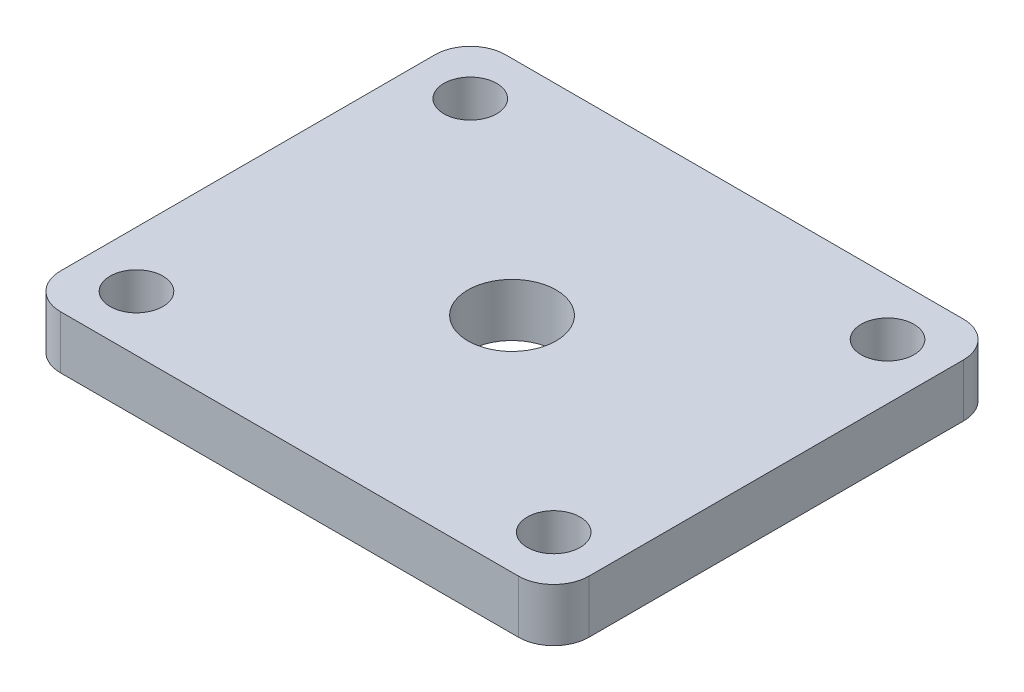
ISO-10303-21;
HEADER;
FILE_DESCRIPTION(('STEP AP214'),'2;1');
FILE_NAME('part.step','',(''),(''),'','','');
FILE_SCHEMA(('AUTOMOTIVE_DESIGN { 1 0 10303 214 1 1 1 1 }'));
ENDSEC;
DATA;
#1=APPLICATION_CONTEXT('core data for automotive mechanical design processes');
#2=APPLICATION_PROTOCOL_DEFINITION('international standard','automotive_design',2000,#1);
#3=PRODUCT_CONTEXT('',#1,'mechanical');
#4=PRODUCT('Part','Part','',(#3));
#5=PRODUCT_RELATED_PRODUCT_CATEGORY('part','',(#4));
#6=PRODUCT_DEFINITION_FORMATION('','',#4);
#7=PRODUCT_DEFINITION_CONTEXT('part definition',#1,'design');
#8=PRODUCT_DEFINITION('design','',#6,#7);
#9=PRODUCT_DEFINITION_SHAPE('','',#8);
#10=(LENGTH_UNIT() NAMED_UNIT(*) SI_UNIT(.MILLI.,.METRE.));
#11=(NAMED_UNIT(*) PLANE_ANGLE_UNIT() SI_UNIT($,.RADIAN.));
#12=(NAMED_UNIT(*) SI_UNIT($,.STERADIAN.) SOLID_ANGLE_UNIT());
#13=UNCERTAINTY_MEASURE_WITH_UNIT(LENGTH_MEASURE(1.E-05),#10,'distance_accuracy_value','');
#14=(GEOMETRIC_REPRESENTATION_CONTEXT(3) GLOBAL_UNCERTAINTY_ASSIGNED_CONTEXT((#13)) GLOBAL_UNIT_ASSIGNED_CONTEXT((#10,
#11,#12)) REPRESENTATION_CONTEXT('',''));
#15=CARTESIAN_POINT('',(0.,0.,0.));
#16=DIRECTION('',(0.,0.,1.));
#17=DIRECTION('',(1.,0.,0.));
#18=AXIS2_PLACEMENT_3D('',#15,#16,#17);
#19=CARTESIAN_POINT('',(0.,3.81,0.));
#20=DIRECTION('',(0.,-1.,0.));
#21=DIRECTION('',(0.,0.,-1.));
#22=AXIS2_PLACEMENT_3D('',#19,#20,#21);
#23=PLANE('',#22);
#24=DIRECTION('',(-1.,0.,0.));
#25=VECTOR('',#24,1.);
#26=CARTESIAN_POINT('',(0.,3.81,-32.));
#27=LINE('',#26,#25);
#28=CARTESIAN_POINT('',(35.46,3.81,-32.));
#29=VERTEX_POINT('',#28);
#30=CARTESIAN_POINT('',(2.54,3.81,-32.));
#31=VERTEX_POINT('',#30);
#32=EDGE_CURVE('E148',#29,#31,#27,.T.);
#33=ORIENTED_EDGE('',*,*,#32,.T.);
#34=CARTESIAN_POINT('',(2.54,3.81,-29.46));
#35=DIRECTION('',(0.,-1.,0.));
#36=DIRECTION('',(0.,0.,-1.));
#37=AXIS2_PLACEMENT_3D('',#34,#35,#36);
#38=CIRCLE('',#37,2.54);
#39=CARTESIAN_POINT('',(0.,3.81,-29.46));
#40=VERTEX_POINT('',#39);
#41=EDGE_CURVE('E178',#31,#40,#38,.F.);
#42=ORIENTED_EDGE('',*,*,#41,.T.);
#43=DIRECTION('',(0.,0.,1.));
#44=VECTOR('',#43,1.);
#45=CARTESIAN_POINT('',(0.,3.81,0.));
#46=LINE('',#45,#44);
#47=CARTESIAN_POINT('',(0.,3.81,-2.54));
#48=VERTEX_POINT('',#47);
#49=EDGE_CURVE('E127',#40,#48,#46,.T.);
#50=ORIENTED_EDGE('',*,*,#49,.T.);
#51=CARTESIAN_POINT('',(2.54,3.81,-2.54));
#52=DIRECTION('',(0.,-1.,0.));
#53=DIRECTION('',(0.,0.,-1.));
#54=AXIS2_PLACEMENT_3D('',#51,#52,#53);
#55=CIRCLE('',#54,2.54);
#56=CARTESIAN_POINT('',(2.54,3.81,0.));
#57=VERTEX_POINT('',#56);
#58=EDGE_CURVE('E170',#48,#57,#55,.F.);
#59=ORIENTED_EDGE('',*,*,#58,.T.);
#60=DIRECTION('',(1.,0.,0.));
#61=VECTOR('',#60,1.);
#62=CARTESIAN_POINT('',(0.,3.81,0.));
#63=LINE('',#62,#61);
#64=CARTESIAN_POINT('',(35.46,3.81,0.));
#65=VERTEX_POINT('',#64);
#66=EDGE_CURVE('E193',#57,#65,#63,.T.);
#67=ORIENTED_EDGE('',*,*,#66,.T.);
#68=CARTESIAN_POINT('',(35.46,3.81,-2.54));
#69=DIRECTION('',(0.,-1.,0.));
#70=DIRECTION('',(0.,0.,-1.));
#71=AXIS2_PLACEMENT_3D('',#68,#69,#70);
#72=CIRCLE('',#71,2.54);
#73=CARTESIAN_POINT('',(38.,3.81,-2.54));
#74=VERTEX_POINT('',#73);
#75=EDGE_CURVE('E62',#65,#74,#72,.F.);
#76=ORIENTED_EDGE('',*,*,#75,.T.);
#77=DIRECTION('',(0.,0.,-1.));
#78=VECTOR('',#77,1.);
#79=CARTESIAN_POINT('',(38.,3.81,0.));
#80=LINE('',#79,#78);
#81=CARTESIAN_POINT('',(38.,3.81,-29.46));
#82=VERTEX_POINT('',#81);
#83=EDGE_CURVE('E201',#74,#82,#80,.T.);
#84=ORIENTED_EDGE('',*,*,#83,.T.);
#85=CARTESIAN_POINT('',(35.46,3.81,-29.46));
#86=DIRECTION('',(0.,-1.,0.));
#87=DIRECTION('',(0.,0.,-1.));
#88=AXIS2_PLACEMENT_3D('',#85,#86,#87);
#89=CIRCLE('',#88,2.54);
#90=EDGE_CURVE('E175',#82,#29,#89,.F.);
#91=ORIENTED_EDGE('',*,*,#90,.T.);
#92=EDGE_LOOP('',(#33,#42,#50,#59,#67,#76,#84,#91));
#93=FACE_BOUND('',#92,.T.);
#94=CARTESIAN_POINT('',(19.,3.81,-16.));
#95=DIRECTION('',(0.,1.,0.));
#96=DIRECTION('',(0.,0.,1.));
#97=AXIS2_PLACEMENT_3D('',#94,#95,#96);
#98=CIRCLE('',#97,3.175);
#99=CARTESIAN_POINT('',(19.,3.81,-19.175));
#100=VERTEX_POINT('',#99);
#101=EDGE_CURVE('E137',#100,#100,#98,.T.);
#102=ORIENTED_EDGE('',*,*,#101,.F.);
#103=EDGE_LOOP('',(#102));
#104=FACE_BOUND('',#103,.T.);
#105=CARTESIAN_POINT('',(4.,3.81,-4.00000000000001));
#106=DIRECTION('',(0.,1.,0.));
#107=DIRECTION('',(0.,0.,1.));
#108=AXIS2_PLACEMENT_3D('',#105,#106,#107);
#109=CIRCLE('',#108,1.89865);
#110=CARTESIAN_POINT('',(4.,3.81,-5.89865000000001));
#111=VERTEX_POINT('',#110);
#112=EDGE_CURVE('E213',#111,#111,#109,.T.);
#113=ORIENTED_EDGE('',*,*,#112,.F.);
#114=EDGE_LOOP('',(#113));
#115=FACE_BOUND('',#114,.T.);
#116=CARTESIAN_POINT('',(4.,3.81,-28.));
#117=DIRECTION('',(0.,1.,0.));
#118=DIRECTION('',(0.,0.,1.));
#119=AXIS2_PLACEMENT_3D('',#116,#117,#118);
#120=CIRCLE('',#119,1.89865);
#121=CARTESIAN_POINT('',(4.,3.81,-29.89865));
#122=VERTEX_POINT('',#121);
#123=EDGE_CURVE('E219',#122,#122,#120,.T.);
#124=ORIENTED_EDGE('',*,*,#123,.F.);
#125=EDGE_LOOP('',(#124));
#126=FACE_BOUND('',#125,.T.);
#127=CARTESIAN_POINT('',(34.,3.81,-28.));
#128=DIRECTION('',(0.,1.,0.));
#129=DIRECTION('',(0.,0.,1.));
#130=AXIS2_PLACEMENT_3D('',#127,#128,#129);
#131=CIRCLE('',#130,1.89865);
#132=CARTESIAN_POINT('',(34.,3.81,-29.89865));
#133=VERTEX_POINT('',#132);
#134=EDGE_CURVE('E227',#133,#133,#131,.T.);
#135=ORIENTED_EDGE('',*,*,#134,.F.);
#136=EDGE_LOOP('',(#135));
#137=FACE_BOUND('',#136,.T.);
#138=CARTESIAN_POINT('',(34.,3.81,-4.));
#139=DIRECTION('',(0.,1.,0.));
#140=DIRECTION('',(0.,0.,1.));
#141=AXIS2_PLACEMENT_3D('',#138,#139,#140);
#142=CIRCLE('',#141,1.89865);
#143=CARTESIAN_POINT('',(34.,3.81,-5.89865));
#144=VERTEX_POINT('',#143);
#145=EDGE_CURVE('E235',#144,#144,#142,.T.);
#146=ORIENTED_EDGE('',*,*,#145,.F.);
#147=EDGE_LOOP('',(#146));
#148=FACE_BOUND('',#147,.T.);
#149=ADVANCED_FACE('F39',(#93,#104,#115,#126,#137,#148),#23,.F.);
#150=CARTESIAN_POINT('',(0.,0.,0.));
#151=DIRECTION('',(0.,-1.,0.));
#152=DIRECTION('',(0.,0.,-1.));
#153=AXIS2_PLACEMENT_3D('',#150,#151,#152);
#154=PLANE('',#153);
#155=CARTESIAN_POINT('',(34.,0.,-28.));
#156=DIRECTION('',(0.,1.,0.));
#157=DIRECTION('',(0.,0.,1.));
#158=AXIS2_PLACEMENT_3D('',#155,#156,#157);
#159=CIRCLE('',#158,1.89865);
#160=CARTESIAN_POINT('',(34.,0.,-29.89865));
#161=VERTEX_POINT('',#160);
#162=EDGE_CURVE('E231',#161,#161,#159,.T.);
#163=ORIENTED_EDGE('',*,*,#162,.T.);
#164=EDGE_LOOP('',(#163));
#165=FACE_BOUND('',#164,.T.);
#166=CARTESIAN_POINT('',(4.,0.,-4.00000000000001));
#167=DIRECTION('',(0.,1.,0.));
#168=DIRECTION('',(0.,0.,1.));
#169=AXIS2_PLACEMENT_3D('',#166,#167,#168);
#170=CIRCLE('',#169,1.89865);
#171=CARTESIAN_POINT('',(4.,0.,-5.89865000000001));
#172=VERTEX_POINT('',#171);
#173=EDGE_CURVE('E215',#172,#172,#170,.T.);
#174=ORIENTED_EDGE('',*,*,#173,.T.);
#175=EDGE_LOOP('',(#174));
#176=FACE_BOUND('',#175,.T.);
#177=DIRECTION('',(0.,0.,1.));
#178=VECTOR('',#177,1.);
#179=CARTESIAN_POINT('',(0.,0.,0.));
#180=LINE('',#179,#178);
#181=CARTESIAN_POINT('',(0.,0.,-29.46));
#182=VERTEX_POINT('',#181);
#183=CARTESIAN_POINT('',(0.,0.,-2.54));
#184=VERTEX_POINT('',#183);
#185=EDGE_CURVE('E124',#182,#184,#180,.T.);
#186=ORIENTED_EDGE('',*,*,#185,.F.);
#187=CARTESIAN_POINT('',(2.54,0.,-29.46));
#188=DIRECTION('',(0.,-1.,0.));
#189=DIRECTION('',(0.,0.,-1.));
#190=AXIS2_PLACEMENT_3D('',#187,#188,#189);
#191=CIRCLE('',#190,2.54);
#192=CARTESIAN_POINT('',(2.54,0.,-32.));
#193=VERTEX_POINT('',#192);
#194=EDGE_CURVE('E106',#182,#193,#191,.T.);
#195=ORIENTED_EDGE('',*,*,#194,.T.);
#196=DIRECTION('',(-1.,0.,0.));
#197=VECTOR('',#196,1.);
#198=CARTESIAN_POINT('',(0.,0.,-32.));
#199=LINE('',#198,#197);
#200=CARTESIAN_POINT('',(35.46,0.,-32.));
#201=VERTEX_POINT('',#200);
#202=EDGE_CURVE('E153',#201,#193,#199,.T.);
#203=ORIENTED_EDGE('',*,*,#202,.F.);
#204=CARTESIAN_POINT('',(35.46,0.,-29.46));
#205=DIRECTION('',(0.,-1.,0.));
#206=DIRECTION('',(0.,0.,-1.));
#207=AXIS2_PLACEMENT_3D('',#204,#205,#206);
#208=CIRCLE('',#207,2.54);
#209=CARTESIAN_POINT('',(38.,0.,-29.46));
#210=VERTEX_POINT('',#209);
#211=EDGE_CURVE('E118',#201,#210,#208,.T.);
#212=ORIENTED_EDGE('',*,*,#211,.T.);
#213=DIRECTION('',(0.,0.,-1.));
#214=VECTOR('',#213,1.);
#215=CARTESIAN_POINT('',(38.,0.,0.));
#216=LINE('',#215,#214);
#217=CARTESIAN_POINT('',(38.,0.,-2.54));
#218=VERTEX_POINT('',#217);
#219=EDGE_CURVE('E142',#218,#210,#216,.T.);
#220=ORIENTED_EDGE('',*,*,#219,.F.);
#221=CARTESIAN_POINT('',(35.46,0.,-2.54));
#222=DIRECTION('',(0.,-1.,0.));
#223=DIRECTION('',(0.,0.,-1.));
#224=AXIS2_PLACEMENT_3D('',#221,#222,#223);
#225=CIRCLE('',#224,2.54);
#226=CARTESIAN_POINT('',(35.46,0.,0.));
#227=VERTEX_POINT('',#226);
#228=EDGE_CURVE('E160',#218,#227,#225,.T.);
#229=ORIENTED_EDGE('',*,*,#228,.T.);
#230=DIRECTION('',(1.,0.,0.));
#231=VECTOR('',#230,1.);
#232=CARTESIAN_POINT('',(0.,0.,0.));
#233=LINE('',#232,#231);
#234=CARTESIAN_POINT('',(2.54,0.,0.));
#235=VERTEX_POINT('',#234);
#236=EDGE_CURVE('E136',#235,#227,#233,.T.);
#237=ORIENTED_EDGE('',*,*,#236,.F.);
#238=CARTESIAN_POINT('',(2.54,0.,-2.54));
#239=DIRECTION('',(0.,-1.,0.));
#240=DIRECTION('',(0.,0.,-1.));
#241=AXIS2_PLACEMENT_3D('',#238,#239,#240);
#242=CIRCLE('',#241,2.54);
#243=EDGE_CURVE('E129',#235,#184,#242,.T.);
#244=ORIENTED_EDGE('',*,*,#243,.T.);
#245=EDGE_LOOP('',(#186,#195,#203,#212,#220,#229,#237,#244));
#246=FACE_BOUND('',#245,.T.);
#247=CARTESIAN_POINT('',(19.,0.,-16.));
#248=DIRECTION('',(0.,1.,0.));
#249=DIRECTION('',(0.,0.,1.));
#250=AXIS2_PLACEMENT_3D('',#247,#248,#249);
#251=CIRCLE('',#250,3.175);
#252=CARTESIAN_POINT('',(19.,0.,-19.175));
#253=VERTEX_POINT('',#252);
#254=EDGE_CURVE('E145',#253,#253,#251,.T.);
#255=ORIENTED_EDGE('',*,*,#254,.T.);
#256=EDGE_LOOP('',(#255));
#257=FACE_BOUND('',#256,.T.);
#258=CARTESIAN_POINT('',(4.,0.,-28.));
#259=DIRECTION('',(0.,1.,0.));
#260=DIRECTION('',(0.,0.,1.));
#261=AXIS2_PLACEMENT_3D('',#258,#259,#260);
#262=CIRCLE('',#261,1.89865);
#263=CARTESIAN_POINT('',(4.,0.,-29.89865));
#264=VERTEX_POINT('',#263);
#265=EDGE_CURVE('E223',#264,#264,#262,.T.);
#266=ORIENTED_EDGE('',*,*,#265,.T.);
#267=EDGE_LOOP('',(#266));
#268=FACE_BOUND('',#267,.T.);
#269=CARTESIAN_POINT('',(34.,0.,-4.));
#270=DIRECTION('',(0.,1.,0.));
#271=DIRECTION('',(0.,0.,1.));
#272=AXIS2_PLACEMENT_3D('',#269,#270,#271);
#273=CIRCLE('',#272,1.89865);
#274=CARTESIAN_POINT('',(34.,0.,-5.89865));
#275=VERTEX_POINT('',#274);
#276=EDGE_CURVE('E239',#275,#275,#273,.T.);
#277=ORIENTED_EDGE('',*,*,#276,.T.);
#278=EDGE_LOOP('',(#277));
#279=FACE_BOUND('',#278,.T.);
#280=ADVANCED_FACE('F132',(#165,#176,#246,#257,#268,#279),#154,.T.);
#281=CARTESIAN_POINT('',(0.,3.81,0.));
#282=DIRECTION('',(1.,0.,0.));
#283=DIRECTION('',(0.,0.,-1.));
#284=AXIS2_PLACEMENT_3D('',#281,#282,#283);
#285=PLANE('',#284);
#286=ORIENTED_EDGE('',*,*,#49,.F.);
#287=DIRECTION('',(0.,-1.,0.));
#288=VECTOR('',#287,1.);
#289=CARTESIAN_POINT('',(0.,3.81,-29.46));
#290=LINE('',#289,#288);
#291=EDGE_CURVE('E110',#40,#182,#290,.T.);
#292=ORIENTED_EDGE('',*,*,#291,.T.);
#293=ORIENTED_EDGE('',*,*,#185,.T.);
#294=DIRECTION('',(0.,-1.,0.));
#295=VECTOR('',#294,1.);
#296=CARTESIAN_POINT('',(0.,3.81,-2.54));
#297=LINE('',#296,#295);
#298=EDGE_CURVE('E130',#184,#48,#297,.F.);
#299=ORIENTED_EDGE('',*,*,#298,.T.);
#300=EDGE_LOOP('',(#286,#292,#293,#299));
#301=FACE_BOUND('',#300,.T.);
#302=ADVANCED_FACE('F123',(#301),#285,.F.);
#303=CARTESIAN_POINT('',(0.,3.81,0.));
#304=DIRECTION('',(0.,0.,-1.));
#305=DIRECTION('',(-1.,0.,0.));
#306=AXIS2_PLACEMENT_3D('',#303,#304,#305);
#307=PLANE('',#306);
#308=ORIENTED_EDGE('',*,*,#236,.T.);
#309=DIRECTION('',(0.,-1.,0.));
#310=VECTOR('',#309,1.);
#311=CARTESIAN_POINT('',(35.46,3.81,0.));
#312=LINE('',#311,#310);
#313=EDGE_CURVE('E11',#227,#65,#312,.F.);
#314=ORIENTED_EDGE('',*,*,#313,.T.);
#315=ORIENTED_EDGE('',*,*,#66,.F.);
#316=DIRECTION('',(0.,-1.,0.));
#317=VECTOR('',#316,1.);
#318=CARTESIAN_POINT('',(2.54,3.81,0.));
#319=LINE('',#318,#317);
#320=EDGE_CURVE('E48',#57,#235,#319,.T.);
#321=ORIENTED_EDGE('',*,*,#320,.T.);
#322=EDGE_LOOP('',(#308,#314,#315,#321));
#323=FACE_BOUND('',#322,.T.);
#324=ADVANCED_FACE('F191',(#323),#307,.F.);
#325=CARTESIAN_POINT('',(38.,3.81,0.));
#326=DIRECTION('',(-1.,0.,0.));
#327=DIRECTION('',(0.,0.,1.));
#328=AXIS2_PLACEMENT_3D('',#325,#326,#327);
#329=PLANE('',#328);
#330=ORIENTED_EDGE('',*,*,#219,.T.);
#331=DIRECTION('',(0.,-1.,0.));
#332=VECTOR('',#331,1.);
#333=CARTESIAN_POINT('',(38.,3.81,-29.46));
#334=LINE('',#333,#332);
#335=EDGE_CURVE('E55',#210,#82,#334,.F.);
#336=ORIENTED_EDGE('',*,*,#335,.T.);
#337=ORIENTED_EDGE('',*,*,#83,.F.);
#338=DIRECTION('',(0.,-1.,0.));
#339=VECTOR('',#338,1.);
#340=CARTESIAN_POINT('',(38.,3.81,-2.54));
#341=LINE('',#340,#339);
#342=EDGE_CURVE('E181',#74,#218,#341,.T.);
#343=ORIENTED_EDGE('',*,*,#342,.T.);
#344=EDGE_LOOP('',(#330,#336,#337,#343));
#345=FACE_BOUND('',#344,.T.);
#346=ADVANCED_FACE('F200',(#345),#329,.F.);
#347=CARTESIAN_POINT('',(0.,3.81,-32.));
#348=DIRECTION('',(0.,0.,1.));
#349=DIRECTION('',(1.,0.,0.));
#350=AXIS2_PLACEMENT_3D('',#347,#348,#349);
#351=PLANE('',#350);
#352=ORIENTED_EDGE('',*,*,#202,.T.);
#353=DIRECTION('',(0.,-1.,0.));
#354=VECTOR('',#353,1.);
#355=CARTESIAN_POINT('',(2.54,3.81,-32.));
#356=LINE('',#355,#354);
#357=EDGE_CURVE('E111',#193,#31,#356,.F.);
#358=ORIENTED_EDGE('',*,*,#357,.T.);
#359=ORIENTED_EDGE('',*,*,#32,.F.);
#360=DIRECTION('',(0.,-1.,0.));
#361=VECTOR('',#360,1.);
#362=CARTESIAN_POINT('',(35.46,3.81,-32.));
#363=LINE('',#362,#361);
#364=EDGE_CURVE('E117',#29,#201,#363,.T.);
#365=ORIENTED_EDGE('',*,*,#364,.T.);
#366=EDGE_LOOP('',(#352,#358,#359,#365));
#367=FACE_BOUND('',#366,.T.);
#368=ADVANCED_FACE('F262',(#367),#351,.F.);
#369=CARTESIAN_POINT('',(19.,3.81,-16.));
#370=DIRECTION('',(0.,-1.,0.));
#371=DIRECTION('',(0.,0.,-1.));
#372=AXIS2_PLACEMENT_3D('',#369,#370,#371);
#373=CYLINDRICAL_SURFACE('',#372,3.175);
#374=CARTESIAN_POINT('',(19.,3.81,-19.175));
#375=CARTESIAN_POINT('',(19.,3.7703125,-19.175));
#376=CARTESIAN_POINT('',(19.,3.730625,-19.175));
#377=CARTESIAN_POINT('',(19.,3.65125,-19.175));
#378=CARTESIAN_POINT('',(19.,3.6115625,-19.175));
#379=CARTESIAN_POINT('',(19.,3.5321875,-19.175));
#380=CARTESIAN_POINT('',(19.,3.4925,-19.175));
#381=CARTESIAN_POINT('',(19.,3.413125,-19.175));
#382=CARTESIAN_POINT('',(19.,3.3734375,-19.175));
#383=CARTESIAN_POINT('',(19.,3.2940625,-19.175));
#384=CARTESIAN_POINT('',(19.,3.254375,-19.175));
#385=CARTESIAN_POINT('',(19.,3.175,-19.175));
#386=CARTESIAN_POINT('',(19.,3.1353125,-19.175));
#387=CARTESIAN_POINT('',(19.,3.0559375,-19.175));
#388=CARTESIAN_POINT('',(19.,3.01625,-19.175));
#389=CARTESIAN_POINT('',(19.,2.936875,-19.175));
#390=CARTESIAN_POINT('',(19.,2.8971875,-19.175));
#391=CARTESIAN_POINT('',(19.,2.8178125,-19.175));
#392=CARTESIAN_POINT('',(19.,2.778125,-19.175));
#393=CARTESIAN_POINT('',(19.,2.69875,-19.175));
#394=CARTESIAN_POINT('',(19.,2.6590625,-19.175));
#395=CARTESIAN_POINT('',(19.,2.5796875,-19.175));
#396=CARTESIAN_POINT('',(19.,2.54,-19.175));
#397=CARTESIAN_POINT('',(19.,2.460625,-19.175));
#398=CARTESIAN_POINT('',(19.,2.4209375,-19.175));
#399=CARTESIAN_POINT('',(19.,2.3415625,-19.175));
#400=CARTESIAN_POINT('',(19.,2.301875,-19.175));
#401=CARTESIAN_POINT('',(19.,2.2225,-19.175));
#402=CARTESIAN_POINT('',(19.,2.1828125,-19.175));
#403=CARTESIAN_POINT('',(19.,2.1034375,-19.175));
#404=CARTESIAN_POINT('',(19.,2.06375,-19.175));
#405=CARTESIAN_POINT('',(19.,1.984375,-19.175));
#406=CARTESIAN_POINT('',(19.,1.9446875,-19.175));
#407=CARTESIAN_POINT('',(19.,1.8653125,-19.175));
#408=CARTESIAN_POINT('',(19.,1.825625,-19.175));
#409=CARTESIAN_POINT('',(19.,1.74625,-19.175));
#410=CARTESIAN_POINT('',(19.,1.7065625,-19.175));
#411=CARTESIAN_POINT('',(19.,1.6271875,-19.175));
#412=CARTESIAN_POINT('',(19.,1.5875,-19.175));
#413=CARTESIAN_POINT('',(19.,1.508125,-19.175));
#414=CARTESIAN_POINT('',(19.,1.4684375,-19.175));
#415=CARTESIAN_POINT('',(19.,1.3890625,-19.175));
#416=CARTESIAN_POINT('',(19.,1.349375,-19.175));
#417=CARTESIAN_POINT('',(19.,1.27,-19.175));
#418=CARTESIAN_POINT('',(19.,1.2303125,-19.175));
#419=CARTESIAN_POINT('',(19.,1.1509375,-19.175));
#420=CARTESIAN_POINT('',(19.,1.11125,-19.175));
#421=CARTESIAN_POINT('',(19.,1.031875,-19.175));
#422=CARTESIAN_POINT('',(19.,0.9921875,-19.175));
#423=CARTESIAN_POINT('',(19.,0.9128125,-19.175));
#424=CARTESIAN_POINT('',(19.,0.873125,-19.175));
#425=CARTESIAN_POINT('',(19.,0.79375,-19.175));
#426=CARTESIAN_POINT('',(19.,0.7540625,-19.175));
#427=CARTESIAN_POINT('',(19.,0.6746875,-19.175));
#428=CARTESIAN_POINT('',(19.,0.635,-19.175));
#429=CARTESIAN_POINT('',(19.,0.555625,-19.175));
#430=CARTESIAN_POINT('',(19.,0.5159375,-19.175));
#431=CARTESIAN_POINT('',(19.,0.4365625,-19.175));
#432=CARTESIAN_POINT('',(19.,0.396875,-19.175));
#433=CARTESIAN_POINT('',(19.,0.3175,-19.175));
#434=CARTESIAN_POINT('',(19.,0.2778125,-19.175));
#435=CARTESIAN_POINT('',(19.,0.1984375,-19.175));
#436=CARTESIAN_POINT('',(19.,0.15875,-19.175));
#437=CARTESIAN_POINT('',(19.,0.0793749999999999,-19.175));
#438=CARTESIAN_POINT('',(19.,0.0396874999999999,-19.175));
#439=CARTESIAN_POINT('',(19.,0.,-19.175));
#440=B_SPLINE_CURVE_WITH_KNOTS('',3,(#374,#375,#376,#377,#378,#379,#380,#381,#382,#383,#384,
#385,#386,#387,#388,#389,#390,#391,#392,#393,#394,#395,#396,#397,#398,#399,#400,#401,#402,#403,
#404,#405,#406,#407,#408,#409,#410,#411,#412,#413,#414,#415,#416,#417,#418,#419,#420,#421,#422,
#423,#424,#425,#426,#427,#428,#429,#430,#431,#432,#433,#434,#435,#436,#437,#438,#439),
.UNSPECIFIED.,.F.,.F.,(4,2,2,2,2,2,2,2,2,2,2,2,2,2,2,2,2,2,2,2,2,2,2,2,2,2,2,2,2,2,2,2,4),(0.,
0.1190625,0.238125,0.3571875,0.47625,0.595312499999999,0.714375,0.833437499999999,
0.952499999999999,1.0715625,1.190625,1.3096875,1.42875,1.5478125,1.666875,1.7859375,1.905,
2.0240625,2.143125,2.2621875,2.38125,2.5003125,2.619375,2.7384375,2.8575,2.9765625,3.095625,
3.2146875,3.33375,3.4528125,3.571875,3.6909375,3.81),.UNSPECIFIED.);
#441=EDGE_CURVE('BSEAM259',#100,#253,#440,.T.);
#442=ORIENTED_EDGE('',*,*,#101,.T.);
#443=ORIENTED_EDGE('',*,*,#254,.F.);
#444=ORIENTED_EDGE('',*,*,#441,.T.);
#445=ORIENTED_EDGE('',*,*,#441,.F.);
#446=EDGE_LOOP('',(#442,#444,#443,#445));
#447=FACE_BOUND('',#446,.T.);
#448=ADVANCED_FACE('F259',(#447),#373,.F.);
#449=CARTESIAN_POINT('',(4.,3.81,-4.00000000000001));
#450=DIRECTION('',(0.,-1.,0.));
#451=DIRECTION('',(0.,0.,-1.));
#452=AXIS2_PLACEMENT_3D('',#449,#450,#451);
#453=CYLINDRICAL_SURFACE('',#452,1.89865);
#454=CARTESIAN_POINT('',(4.,3.81,-5.89865000000001));
#455=CARTESIAN_POINT('',(4.,3.7703125,-5.89865000000001));
#456=CARTESIAN_POINT('',(4.,3.730625,-5.89865000000001));
#457=CARTESIAN_POINT('',(4.,3.65125,-5.89865000000001));
#458=CARTESIAN_POINT('',(4.,3.6115625,-5.89865000000001));
#459=CARTESIAN_POINT('',(4.,3.5321875,-5.89865000000001));
#460=CARTESIAN_POINT('',(4.,3.4925,-5.89865000000001));
#461=CARTESIAN_POINT('',(4.,3.413125,-5.89865000000001));
#462=CARTESIAN_POINT('',(4.,3.3734375,-5.89865000000001));
#463=CARTESIAN_POINT('',(4.,3.2940625,-5.89865000000001));
#464=CARTESIAN_POINT('',(4.,3.254375,-5.89865000000001));
#465=CARTESIAN_POINT('',(4.,3.175,-5.89865000000001));
#466=CARTESIAN_POINT('',(4.,3.1353125,-5.89865000000001));
#467=CARTESIAN_POINT('',(4.,3.0559375,-5.89865000000001));
#468=CARTESIAN_POINT('',(4.,3.01625,-5.89865000000001));
#469=CARTESIAN_POINT('',(4.,2.936875,-5.89865000000001));
#470=CARTESIAN_POINT('',(4.,2.8971875,-5.89865000000001));
#471=CARTESIAN_POINT('',(4.,2.8178125,-5.89865000000001));
#472=CARTESIAN_POINT('',(4.,2.778125,-5.89865000000001));
#473=CARTESIAN_POINT('',(4.,2.69875,-5.89865000000001));
#474=CARTESIAN_POINT('',(4.,2.6590625,-5.89865000000001));
#475=CARTESIAN_POINT('',(4.,2.5796875,-5.89865000000001));
#476=CARTESIAN_POINT('',(4.,2.54,-5.89865000000001));
#477=CARTESIAN_POINT('',(4.,2.460625,-5.89865000000001));
#478=CARTESIAN_POINT('',(4.,2.4209375,-5.89865000000001));
#479=CARTESIAN_POINT('',(4.,2.3415625,-5.89865000000001));
#480=CARTESIAN_POINT('',(4.,2.301875,-5.89865000000001));
#481=CARTESIAN_POINT('',(4.,2.2225,-5.89865000000001));
#482=CARTESIAN_POINT('',(4.,2.1828125,-5.89865000000001));
#483=CARTESIAN_POINT('',(4.,2.1034375,-5.89865000000001));
#484=CARTESIAN_POINT('',(4.,2.06375,-5.89865000000001));
#485=CARTESIAN_POINT('',(4.,1.984375,-5.89865000000001));
#486=CARTESIAN_POINT('',(4.,1.9446875,-5.89865000000001));
#487=CARTESIAN_POINT('',(4.,1.8653125,-5.89865000000001));
#488=CARTESIAN_POINT('',(4.,1.825625,-5.89865000000001));
#489=CARTESIAN_POINT('',(4.,1.74625,-5.89865000000001));
#490=CARTESIAN_POINT('',(4.,1.7065625,-5.89865000000001));
#491=CARTESIAN_POINT('',(4.,1.6271875,-5.89865000000001));
#492=CARTESIAN_POINT('',(4.,1.5875,-5.89865000000001));
#493=CARTESIAN_POINT('',(4.,1.508125,-5.89865000000001));
#494=CARTESIAN_POINT('',(4.,1.4684375,-5.89865000000001));
#495=CARTESIAN_POINT('',(4.,1.3890625,-5.89865000000001));
#496=CARTESIAN_POINT('',(4.,1.349375,-5.89865000000001));
#497=CARTESIAN_POINT('',(4.,1.27,-5.89865000000001));
#498=CARTESIAN_POINT('',(4.,1.2303125,-5.89865000000001));
#499=CARTESIAN_POINT('',(4.,1.1509375,-5.89865000000001));
#500=CARTESIAN_POINT('',(4.,1.11125,-5.89865000000001));
#501=CARTESIAN_POINT('',(4.,1.031875,-5.89865000000001));
#502=CARTESIAN_POINT('',(4.,0.9921875,-5.89865000000001));
#503=CARTESIAN_POINT('',(4.,0.9128125,-5.89865000000001));
#504=CARTESIAN_POINT('',(4.,0.873125,-5.89865000000001));
#505=CARTESIAN_POINT('',(4.,0.79375,-5.89865000000001));
#506=CARTESIAN_POINT('',(4.,0.7540625,-5.89865000000001));
#507=CARTESIAN_POINT('',(4.,0.6746875,-5.89865000000001));
#508=CARTESIAN_POINT('',(4.,0.635,-5.89865000000001));
#509=CARTESIAN_POINT('',(4.,0.555625,-5.89865000000001));
#510=CARTESIAN_POINT('',(4.,0.5159375,-5.89865000000001));
#511=CARTESIAN_POINT('',(4.,0.4365625,-5.89865000000001));
#512=CARTESIAN_POINT('',(4.,0.396875,-5.89865000000001));
#513=CARTESIAN_POINT('',(4.,0.3175,-5.89865000000001));
#514=CARTESIAN_POINT('',(4.,0.2778125,-5.89865000000001));
#515=CARTESIAN_POINT('',(4.,0.1984375,-5.89865000000001));
#516=CARTESIAN_POINT('',(4.,0.15875,-5.89865000000001));
#517=CARTESIAN_POINT('',(4.,0.0793749999999999,-5.89865000000001));
#518=CARTESIAN_POINT('',(4.,0.0396874999999999,-5.89865000000001));
#519=CARTESIAN_POINT('',(4.,0.,-5.89865000000001));
#520=B_SPLINE_CURVE_WITH_KNOTS('',3,(#454,#455,#456,#457,#458,#459,#460,#461,#462,#463,#464,
#465,#466,#467,#468,#469,#470,#471,#472,#473,#474,#475,#476,#477,#478,#479,#480,#481,#482,#483,
#484,#485,#486,#487,#488,#489,#490,#491,#492,#493,#494,#495,#496,#497,#498,#499,#500,#501,#502,
#503,#504,#505,#506,#507,#508,#509,#510,#511,#512,#513,#514,#515,#516,#517,#518,#519),
.UNSPECIFIED.,.F.,.F.,(4,2,2,2,2,2,2,2,2,2,2,2,2,2,2,2,2,2,2,2,2,2,2,2,2,2,2,2,2,2,2,2,4),(0.,
0.1190625,0.238125,0.3571875,0.47625,0.595312499999999,0.714375,0.833437499999999,
0.952499999999999,1.0715625,1.190625,1.3096875,1.42875,1.5478125,1.666875,1.7859375,1.905,
2.0240625,2.143125,2.2621875,2.38125,2.5003125,2.619375,2.7384375,2.8575,2.9765625,3.095625,
3.2146875,3.33375,3.4528125,3.571875,3.6909375,3.81),.UNSPECIFIED.);
#521=EDGE_CURVE('BSEAM365',#111,#172,#520,.T.);
#522=ORIENTED_EDGE('',*,*,#112,.T.);
#523=ORIENTED_EDGE('',*,*,#173,.F.);
#524=ORIENTED_EDGE('',*,*,#521,.T.);
#525=ORIENTED_EDGE('',*,*,#521,.F.);
#526=EDGE_LOOP('',(#522,#524,#523,#525));
#527=FACE_BOUND('',#526,.T.);
#528=ADVANCED_FACE('F365',(#527),#453,.F.);
#529=CARTESIAN_POINT('',(4.,3.81,-28.));
#530=DIRECTION('',(0.,-1.,0.));
#531=DIRECTION('',(0.,0.,-1.));
#532=AXIS2_PLACEMENT_3D('',#529,#530,#531);
#533=CYLINDRICAL_SURFACE('',#532,1.89865);
#534=CARTESIAN_POINT('',(4.,3.81,-29.89865));
#535=CARTESIAN_POINT('',(4.,3.7703125,-29.89865));
#536=CARTESIAN_POINT('',(4.,3.730625,-29.89865));
#537=CARTESIAN_POINT('',(4.,3.65125,-29.89865));
#538=CARTESIAN_POINT('',(4.,3.6115625,-29.89865));
#539=CARTESIAN_POINT('',(4.,3.5321875,-29.89865));
#540=CARTESIAN_POINT('',(4.,3.4925,-29.89865));
#541=CARTESIAN_POINT('',(4.,3.413125,-29.89865));
#542=CARTESIAN_POINT('',(4.,3.3734375,-29.89865));
#543=CARTESIAN_POINT('',(4.,3.2940625,-29.89865));
#544=CARTESIAN_POINT('',(4.,3.254375,-29.89865));
#545=CARTESIAN_POINT('',(4.,3.175,-29.89865));
#546=CARTESIAN_POINT('',(4.,3.1353125,-29.89865));
#547=CARTESIAN_POINT('',(4.,3.0559375,-29.89865));
#548=CARTESIAN_POINT('',(4.,3.01625,-29.89865));
#549=CARTESIAN_POINT('',(4.,2.936875,-29.89865));
#550=CARTESIAN_POINT('',(4.,2.8971875,-29.89865));
#551=CARTESIAN_POINT('',(4.,2.8178125,-29.89865));
#552=CARTESIAN_POINT('',(4.,2.778125,-29.89865));
#553=CARTESIAN_POINT('',(4.,2.69875,-29.89865));
#554=CARTESIAN_POINT('',(4.,2.6590625,-29.89865));
#555=CARTESIAN_POINT('',(4.,2.5796875,-29.89865));
#556=CARTESIAN_POINT('',(4.,2.54,-29.89865));
#557=CARTESIAN_POINT('',(4.,2.460625,-29.89865));
#558=CARTESIAN_POINT('',(4.,2.4209375,-29.89865));
#559=CARTESIAN_POINT('',(4.,2.3415625,-29.89865));
#560=CARTESIAN_POINT('',(4.,2.301875,-29.89865));
#561=CARTESIAN_POINT('',(4.,2.2225,-29.89865));
#562=CARTESIAN_POINT('',(4.,2.1828125,-29.89865));
#563=CARTESIAN_POINT('',(4.,2.1034375,-29.89865));
#564=CARTESIAN_POINT('',(4.,2.06375,-29.89865));
#565=CARTESIAN_POINT('',(4.,1.984375,-29.89865));
#566=CARTESIAN_POINT('',(4.,1.9446875,-29.89865));
#567=CARTESIAN_POINT('',(4.,1.8653125,-29.89865));
#568=CARTESIAN_POINT('',(4.,1.825625,-29.89865));
#569=CARTESIAN_POINT('',(4.,1.74625,-29.89865));
#570=CARTESIAN_POINT('',(4.,1.7065625,-29.89865));
#571=CARTESIAN_POINT('',(4.,1.6271875,-29.89865));
#572=CARTESIAN_POINT('',(4.,1.5875,-29.89865));
#573=CARTESIAN_POINT('',(4.,1.508125,-29.89865));
#574=CARTESIAN_POINT('',(4.,1.4684375,-29.89865));
#575=CARTESIAN_POINT('',(4.,1.3890625,-29.89865));
#576=CARTESIAN_POINT('',(4.,1.349375,-29.89865));
#577=CARTESIAN_POINT('',(4.,1.27,-29.89865));
#578=CARTESIAN_POINT('',(4.,1.2303125,-29.89865));
#579=CARTESIAN_POINT('',(4.,1.1509375,-29.89865));
#580=CARTESIAN_POINT('',(4.,1.11125,-29.89865));
#581=CARTESIAN_POINT('',(4.,1.031875,-29.89865));
#582=CARTESIAN_POINT('',(4.,0.9921875,-29.89865));
#583=CARTESIAN_POINT('',(4.,0.9128125,-29.89865));
#584=CARTESIAN_POINT('',(4.,0.873125,-29.89865));
#585=CARTESIAN_POINT('',(4.,0.79375,-29.89865));
#586=CARTESIAN_POINT('',(4.,0.7540625,-29.89865));
#587=CARTESIAN_POINT('',(4.,0.6746875,-29.89865));
#588=CARTESIAN_POINT('',(4.,0.635,-29.89865));
#589=CARTESIAN_POINT('',(4.,0.555625,-29.89865));
#590=CARTESIAN_POINT('',(4.,0.5159375,-29.89865));
#591=CARTESIAN_POINT('',(4.,0.4365625,-29.89865));
#592=CARTESIAN_POINT('',(4.,0.396875,-29.89865));
#593=CARTESIAN_POINT('',(4.,0.3175,-29.89865));
#594=CARTESIAN_POINT('',(4.,0.2778125,-29.89865));
#595=CARTESIAN_POINT('',(4.,0.1984375,-29.89865));
#596=CARTESIAN_POINT('',(4.,0.15875,-29.89865));
#597=CARTESIAN_POINT('',(4.,0.0793749999999999,-29.89865));
#598=CARTESIAN_POINT('',(4.,0.0396874999999999,-29.89865));
#599=CARTESIAN_POINT('',(4.,0.,-29.89865));
#600=B_SPLINE_CURVE_WITH_KNOTS('',3,(#534,#535,#536,#537,#538,#539,#540,#541,#542,#543,#544,
#545,#546,#547,#548,#549,#550,#551,#552,#553,#554,#555,#556,#557,#558,#559,#560,#561,#562,#563,
#564,#565,#566,#567,#568,#569,#570,#571,#572,#573,#574,#575,#576,#577,#578,#579,#580,#581,#582,
#583,#584,#585,#586,#587,#588,#589,#590,#591,#592,#593,#594,#595,#596,#597,#598,#599),
.UNSPECIFIED.,.F.,.F.,(4,2,2,2,2,2,2,2,2,2,2,2,2,2,2,2,2,2,2,2,2,2,2,2,2,2,2,2,2,2,2,2,4),(0.,
0.1190625,0.238125,0.3571875,0.47625,0.595312499999999,0.714375,0.833437499999999,
0.952499999999999,1.0715625,1.190625,1.3096875,1.42875,1.5478125,1.666875,1.7859375,1.905,
2.0240625,2.143125,2.2621875,2.38125,2.5003125,2.619375,2.7384375,2.8575,2.9765625,3.095625,
3.2146875,3.33375,3.4528125,3.571875,3.6909375,3.81),.UNSPECIFIED.);
#601=EDGE_CURVE('BSEAM355',#122,#264,#600,.T.);
#602=ORIENTED_EDGE('',*,*,#123,.T.);
#603=ORIENTED_EDGE('',*,*,#265,.F.);
#604=ORIENTED_EDGE('',*,*,#601,.T.);
#605=ORIENTED_EDGE('',*,*,#601,.F.);
#606=EDGE_LOOP('',(#602,#604,#603,#605));
#607=FACE_BOUND('',#606,.T.);
#608=ADVANCED_FACE('F355',(#607),#533,.F.);
#609=CARTESIAN_POINT('',(34.,3.81,-28.));
#610=DIRECTION('',(0.,-1.,0.));
#611=DIRECTION('',(0.,0.,-1.));
#612=AXIS2_PLACEMENT_3D('',#609,#610,#611);
#613=CYLINDRICAL_SURFACE('',#612,1.89865);
#614=CARTESIAN_POINT('',(34.,3.81,-29.89865));
#615=CARTESIAN_POINT('',(34.,3.7703125,-29.89865));
#616=CARTESIAN_POINT('',(34.,3.730625,-29.89865));
#617=CARTESIAN_POINT('',(34.,3.65125,-29.89865));
#618=CARTESIAN_POINT('',(34.,3.6115625,-29.89865));
#619=CARTESIAN_POINT('',(34.,3.5321875,-29.89865));
#620=CARTESIAN_POINT('',(34.,3.4925,-29.89865));
#621=CARTESIAN_POINT('',(34.,3.413125,-29.89865));
#622=CARTESIAN_POINT('',(34.,3.3734375,-29.89865));
#623=CARTESIAN_POINT('',(34.,3.2940625,-29.89865));
#624=CARTESIAN_POINT('',(34.,3.254375,-29.89865));
#625=CARTESIAN_POINT('',(34.,3.175,-29.89865));
#626=CARTESIAN_POINT('',(34.,3.1353125,-29.89865));
#627=CARTESIAN_POINT('',(34.,3.0559375,-29.89865));
#628=CARTESIAN_POINT('',(34.,3.01625,-29.89865));
#629=CARTESIAN_POINT('',(34.,2.936875,-29.89865));
#630=CARTESIAN_POINT('',(34.,2.8971875,-29.89865));
#631=CARTESIAN_POINT('',(34.,2.8178125,-29.89865));
#632=CARTESIAN_POINT('',(34.,2.778125,-29.89865));
#633=CARTESIAN_POINT('',(34.,2.69875,-29.89865));
#634=CARTESIAN_POINT('',(34.,2.6590625,-29.89865));
#635=CARTESIAN_POINT('',(34.,2.5796875,-29.89865));
#636=CARTESIAN_POINT('',(34.,2.54,-29.89865));
#637=CARTESIAN_POINT('',(34.,2.460625,-29.89865));
#638=CARTESIAN_POINT('',(34.,2.4209375,-29.89865));
#639=CARTESIAN_POINT('',(34.,2.3415625,-29.89865));
#640=CARTESIAN_POINT('',(34.,2.301875,-29.89865));
#641=CARTESIAN_POINT('',(34.,2.2225,-29.89865));
#642=CARTESIAN_POINT('',(34.,2.1828125,-29.89865));
#643=CARTESIAN_POINT('',(34.,2.1034375,-29.89865));
#644=CARTESIAN_POINT('',(34.,2.06375,-29.89865));
#645=CARTESIAN_POINT('',(34.,1.984375,-29.89865));
#646=CARTESIAN_POINT('',(34.,1.9446875,-29.89865));
#647=CARTESIAN_POINT('',(34.,1.8653125,-29.89865));
#648=CARTESIAN_POINT('',(34.,1.825625,-29.89865));
#649=CARTESIAN_POINT('',(34.,1.74625,-29.89865));
#650=CARTESIAN_POINT('',(34.,1.7065625,-29.89865));
#651=CARTESIAN_POINT('',(34.,1.6271875,-29.89865));
#652=CARTESIAN_POINT('',(34.,1.5875,-29.89865));
#653=CARTESIAN_POINT('',(34.,1.508125,-29.89865));
#654=CARTESIAN_POINT('',(34.,1.4684375,-29.89865));
#655=CARTESIAN_POINT('',(34.,1.3890625,-29.89865));
#656=CARTESIAN_POINT('',(34.,1.349375,-29.89865));
#657=CARTESIAN_POINT('',(34.,1.27,-29.89865));
#658=CARTESIAN_POINT('',(34.,1.2303125,-29.89865));
#659=CARTESIAN_POINT('',(34.,1.1509375,-29.89865));
#660=CARTESIAN_POINT('',(34.,1.11125,-29.89865));
#661=CARTESIAN_POINT('',(34.,1.031875,-29.89865));
#662=CARTESIAN_POINT('',(34.,0.9921875,-29.89865));
#663=CARTESIAN_POINT('',(34.,0.9128125,-29.89865));
#664=CARTESIAN_POINT('',(34.,0.873125,-29.89865));
#665=CARTESIAN_POINT('',(34.,0.79375,-29.89865));
#666=CARTESIAN_POINT('',(34.,0.7540625,-29.89865));
#667=CARTESIAN_POINT('',(34.,0.6746875,-29.89865));
#668=CARTESIAN_POINT('',(34.,0.635,-29.89865));
#669=CARTESIAN_POINT('',(34.,0.555625,-29.89865));
#670=CARTESIAN_POINT('',(34.,0.5159375,-29.89865));
#671=CARTESIAN_POINT('',(34.,0.4365625,-29.89865));
#672=CARTESIAN_POINT('',(34.,0.396875,-29.89865));
#673=CARTESIAN_POINT('',(34.,0.3175,-29.89865));
#674=CARTESIAN_POINT('',(34.,0.2778125,-29.89865));
#675=CARTESIAN_POINT('',(34.,0.1984375,-29.89865));
#676=CARTESIAN_POINT('',(34.,0.15875,-29.89865));
#677=CARTESIAN_POINT('',(34.,0.0793749999999999,-29.89865));
#678=CARTESIAN_POINT('',(34.,0.0396874999999999,-29.89865));
#679=CARTESIAN_POINT('',(34.,0.,-29.89865));
#680=B_SPLINE_CURVE_WITH_KNOTS('',3,(#614,#615,#616,#617,#618,#619,#620,#621,#622,#623,#624,
#625,#626,#627,#628,#629,#630,#631,#632,#633,#634,#635,#636,#637,#638,#639,#640,#641,#642,#643,
#644,#645,#646,#647,#648,#649,#650,#651,#652,#653,#654,#655,#656,#657,#658,#659,#660,#661,#662,
#663,#664,#665,#666,#667,#668,#669,#670,#671,#672,#673,#674,#675,#676,#677,#678,#679),
.UNSPECIFIED.,.F.,.F.,(4,2,2,2,2,2,2,2,2,2,2,2,2,2,2,2,2,2,2,2,2,2,2,2,2,2,2,2,2,2,2,2,4),(0.,
0.1190625,0.238125,0.3571875,0.47625,0.595312499999999,0.714375,0.833437499999999,
0.952499999999999,1.0715625,1.190625,1.3096875,1.42875,1.5478125,1.666875,1.7859375,1.905,
2.0240625,2.143125,2.2621875,2.38125,2.5003125,2.619375,2.7384375,2.8575,2.9765625,3.095625,
3.2146875,3.33375,3.4528125,3.571875,3.6909375,3.81),.UNSPECIFIED.);
#681=EDGE_CURVE('BSEAM346',#133,#161,#680,.T.);
#682=ORIENTED_EDGE('',*,*,#134,.T.);
#683=ORIENTED_EDGE('',*,*,#162,.F.);
#684=ORIENTED_EDGE('',*,*,#681,.T.);
#685=ORIENTED_EDGE('',*,*,#681,.F.);
#686=EDGE_LOOP('',(#682,#684,#683,#685));
#687=FACE_BOUND('',#686,.T.);
#688=ADVANCED_FACE('F346',(#687),#613,.F.);
#689=CARTESIAN_POINT('',(34.,3.81,-4.));
#690=DIRECTION('',(0.,-1.,0.));
#691=DIRECTION('',(0.,0.,-1.));
#692=AXIS2_PLACEMENT_3D('',#689,#690,#691);
#693=CYLINDRICAL_SURFACE('',#692,1.89865);
#694=CARTESIAN_POINT('',(34.,3.81,-5.89865));
#695=CARTESIAN_POINT('',(34.,3.7703125,-5.89865));
#696=CARTESIAN_POINT('',(34.,3.730625,-5.89865));
#697=CARTESIAN_POINT('',(34.,3.65125,-5.89865));
#698=CARTESIAN_POINT('',(34.,3.6115625,-5.89865));
#699=CARTESIAN_POINT('',(34.,3.5321875,-5.89865));
#700=CARTESIAN_POINT('',(34.,3.4925,-5.89865));
#701=CARTESIAN_POINT('',(34.,3.413125,-5.89865));
#702=CARTESIAN_POINT('',(34.,3.3734375,-5.89865));
#703=CARTESIAN_POINT('',(34.,3.2940625,-5.89865));
#704=CARTESIAN_POINT('',(34.,3.254375,-5.89865));
#705=CARTESIAN_POINT('',(34.,3.175,-5.89865));
#706=CARTESIAN_POINT('',(34.,3.1353125,-5.89865));
#707=CARTESIAN_POINT('',(34.,3.0559375,-5.89865));
#708=CARTESIAN_POINT('',(34.,3.01625,-5.89865));
#709=CARTESIAN_POINT('',(34.,2.936875,-5.89865));
#710=CARTESIAN_POINT('',(34.,2.8971875,-5.89865));
#711=CARTESIAN_POINT('',(34.,2.8178125,-5.89865));
#712=CARTESIAN_POINT('',(34.,2.778125,-5.89865));
#713=CARTESIAN_POINT('',(34.,2.69875,-5.89865));
#714=CARTESIAN_POINT('',(34.,2.6590625,-5.89865));
#715=CARTESIAN_POINT('',(34.,2.5796875,-5.89865));
#716=CARTESIAN_POINT('',(34.,2.54,-5.89865));
#717=CARTESIAN_POINT('',(34.,2.460625,-5.89865));
#718=CARTESIAN_POINT('',(34.,2.4209375,-5.89865));
#719=CARTESIAN_POINT('',(34.,2.3415625,-5.89865));
#720=CARTESIAN_POINT('',(34.,2.301875,-5.89865));
#721=CARTESIAN_POINT('',(34.,2.2225,-5.89865));
#722=CARTESIAN_POINT('',(34.,2.1828125,-5.89865));
#723=CARTESIAN_POINT('',(34.,2.1034375,-5.89865));
#724=CARTESIAN_POINT('',(34.,2.06375,-5.89865));
#725=CARTESIAN_POINT('',(34.,1.984375,-5.89865));
#726=CARTESIAN_POINT('',(34.,1.9446875,-5.89865));
#727=CARTESIAN_POINT('',(34.,1.8653125,-5.89865));
#728=CARTESIAN_POINT('',(34.,1.825625,-5.89865));
#729=CARTESIAN_POINT('',(34.,1.74625,-5.89865));
#730=CARTESIAN_POINT('',(34.,1.7065625,-5.89865));
#731=CARTESIAN_POINT('',(34.,1.6271875,-5.89865));
#732=CARTESIAN_POINT('',(34.,1.5875,-5.89865));
#733=CARTESIAN_POINT('',(34.,1.508125,-5.89865));
#734=CARTESIAN_POINT('',(34.,1.4684375,-5.89865));
#735=CARTESIAN_POINT('',(34.,1.3890625,-5.89865));
#736=CARTESIAN_POINT('',(34.,1.349375,-5.89865));
#737=CARTESIAN_POINT('',(34.,1.27,-5.89865));
#738=CARTESIAN_POINT('',(34.,1.2303125,-5.89865));
#739=CARTESIAN_POINT('',(34.,1.1509375,-5.89865));
#740=CARTESIAN_POINT('',(34.,1.11125,-5.89865));
#741=CARTESIAN_POINT('',(34.,1.031875,-5.89865));
#742=CARTESIAN_POINT('',(34.,0.9921875,-5.89865));
#743=CARTESIAN_POINT('',(34.,0.9128125,-5.89865));
#744=CARTESIAN_POINT('',(34.,0.873125,-5.89865));
#745=CARTESIAN_POINT('',(34.,0.79375,-5.89865));
#746=CARTESIAN_POINT('',(34.,0.7540625,-5.89865));
#747=CARTESIAN_POINT('',(34.,0.6746875,-5.89865));
#748=CARTESIAN_POINT('',(34.,0.635,-5.89865));
#749=CARTESIAN_POINT('',(34.,0.555625,-5.89865));
#750=CARTESIAN_POINT('',(34.,0.5159375,-5.89865));
#751=CARTESIAN_POINT('',(34.,0.4365625,-5.89865));
#752=CARTESIAN_POINT('',(34.,0.396875,-5.89865));
#753=CARTESIAN_POINT('',(34.,0.3175,-5.89865));
#754=CARTESIAN_POINT('',(34.,0.2778125,-5.89865));
#755=CARTESIAN_POINT('',(34.,0.1984375,-5.89865));
#756=CARTESIAN_POINT('',(34.,0.15875,-5.89865));
#757=CARTESIAN_POINT('',(34.,0.0793749999999999,-5.89865));
#758=CARTESIAN_POINT('',(34.,0.0396874999999999,-5.89865));
#759=CARTESIAN_POINT('',(34.,0.,-5.89865));
#760=B_SPLINE_CURVE_WITH_KNOTS('',3,(#694,#695,#696,#697,#698,#699,#700,#701,#702,#703,#704,
#705,#706,#707,#708,#709,#710,#711,#712,#713,#714,#715,#716,#717,#718,#719,#720,#721,#722,#723,
#724,#725,#726,#727,#728,#729,#730,#731,#732,#733,#734,#735,#736,#737,#738,#739,#740,#741,#742,
#743,#744,#745,#746,#747,#748,#749,#750,#751,#752,#753,#754,#755,#756,#757,#758,#759),
.UNSPECIFIED.,.F.,.F.,(4,2,2,2,2,2,2,2,2,2,2,2,2,2,2,2,2,2,2,2,2,2,2,2,2,2,2,2,2,2,2,2,4),(0.,
0.1190625,0.238125,0.3571875,0.47625,0.595312499999999,0.714375,0.833437499999999,
0.952499999999999,1.0715625,1.190625,1.3096875,1.42875,1.5478125,1.666875,1.7859375,1.905,
2.0240625,2.143125,2.2621875,2.38125,2.5003125,2.619375,2.7384375,2.8575,2.9765625,3.095625,
3.2146875,3.33375,3.4528125,3.571875,3.6909375,3.81),.UNSPECIFIED.);
#761=EDGE_CURVE('BSEAM247',#144,#275,#760,.T.);
#762=ORIENTED_EDGE('',*,*,#145,.T.);
#763=ORIENTED_EDGE('',*,*,#276,.F.);
#764=ORIENTED_EDGE('',*,*,#761,.T.);
#765=ORIENTED_EDGE('',*,*,#761,.F.);
#766=EDGE_LOOP('',(#762,#764,#763,#765));
#767=FACE_BOUND('',#766,.T.);
#768=ADVANCED_FACE('F247',(#767),#693,.F.);
#769=CARTESIAN_POINT('',(2.54,3.81,-29.46));
#770=DIRECTION('',(0.,-1.,0.));
#771=DIRECTION('',(0.,0.,-1.));
#772=AXIS2_PLACEMENT_3D('',#769,#770,#771);
#773=CYLINDRICAL_SURFACE('',#772,2.54);
#774=ORIENTED_EDGE('',*,*,#41,.F.);
#775=ORIENTED_EDGE('',*,*,#357,.F.);
#776=ORIENTED_EDGE('',*,*,#194,.F.);
#777=ORIENTED_EDGE('',*,*,#291,.F.);
#778=EDGE_LOOP('',(#774,#775,#776,#777));
#779=FACE_BOUND('',#778,.T.);
#780=ADVANCED_FACE('F109',(#779),#773,.T.);
#781=CARTESIAN_POINT('',(35.46,3.81,-29.46));
#782=DIRECTION('',(0.,-1.,0.));
#783=DIRECTION('',(0.,0.,-1.));
#784=AXIS2_PLACEMENT_3D('',#781,#782,#783);
#785=CYLINDRICAL_SURFACE('',#784,2.54);
#786=ORIENTED_EDGE('',*,*,#90,.F.);
#787=ORIENTED_EDGE('',*,*,#335,.F.);
#788=ORIENTED_EDGE('',*,*,#211,.F.);
#789=ORIENTED_EDGE('',*,*,#364,.F.);
#790=EDGE_LOOP('',(#786,#787,#788,#789));
#791=FACE_BOUND('',#790,.T.);
#792=ADVANCED_FACE('F274',(#791),#785,.T.);
#793=CARTESIAN_POINT('',(35.46,3.81,-2.54));
#794=DIRECTION('',(0.,-1.,0.));
#795=DIRECTION('',(0.,0.,-1.));
#796=AXIS2_PLACEMENT_3D('',#793,#794,#795);
#797=CYLINDRICAL_SURFACE('',#796,2.54);
#798=ORIENTED_EDGE('',*,*,#75,.F.);
#799=ORIENTED_EDGE('',*,*,#313,.F.);
#800=ORIENTED_EDGE('',*,*,#228,.F.);
#801=ORIENTED_EDGE('',*,*,#342,.F.);
#802=EDGE_LOOP('',(#798,#799,#800,#801));
#803=FACE_BOUND('',#802,.T.);
#804=ADVANCED_FACE('F199',(#803),#797,.T.);
#805=CARTESIAN_POINT('',(2.54,3.81,-2.54));
#806=DIRECTION('',(0.,-1.,0.));
#807=DIRECTION('',(0.,0.,-1.));
#808=AXIS2_PLACEMENT_3D('',#805,#806,#807);
#809=CYLINDRICAL_SURFACE('',#808,2.54);
#810=ORIENTED_EDGE('',*,*,#58,.F.);
#811=ORIENTED_EDGE('',*,*,#298,.F.);
#812=ORIENTED_EDGE('',*,*,#243,.F.);
#813=ORIENTED_EDGE('',*,*,#320,.F.);
#814=EDGE_LOOP('',(#810,#811,#812,#813));
#815=FACE_BOUND('',#814,.T.);
#816=ADVANCED_FACE('F41',(#815),#809,.T.);
#817=CLOSED_SHELL('',(#149,#280,#302,#324,#346,#368,#448,#528,#608,#688,#768,#780,#792,#804,#816));
#818=MANIFOLD_SOLID_BREP('B2',#817);
#819=ADVANCED_BREP_SHAPE_REPRESENTATION('',(#18,#818),#14);
#820=SHAPE_DEFINITION_REPRESENTATION(#9,#819);
ENDSEC;
END-ISO-10303-21;
